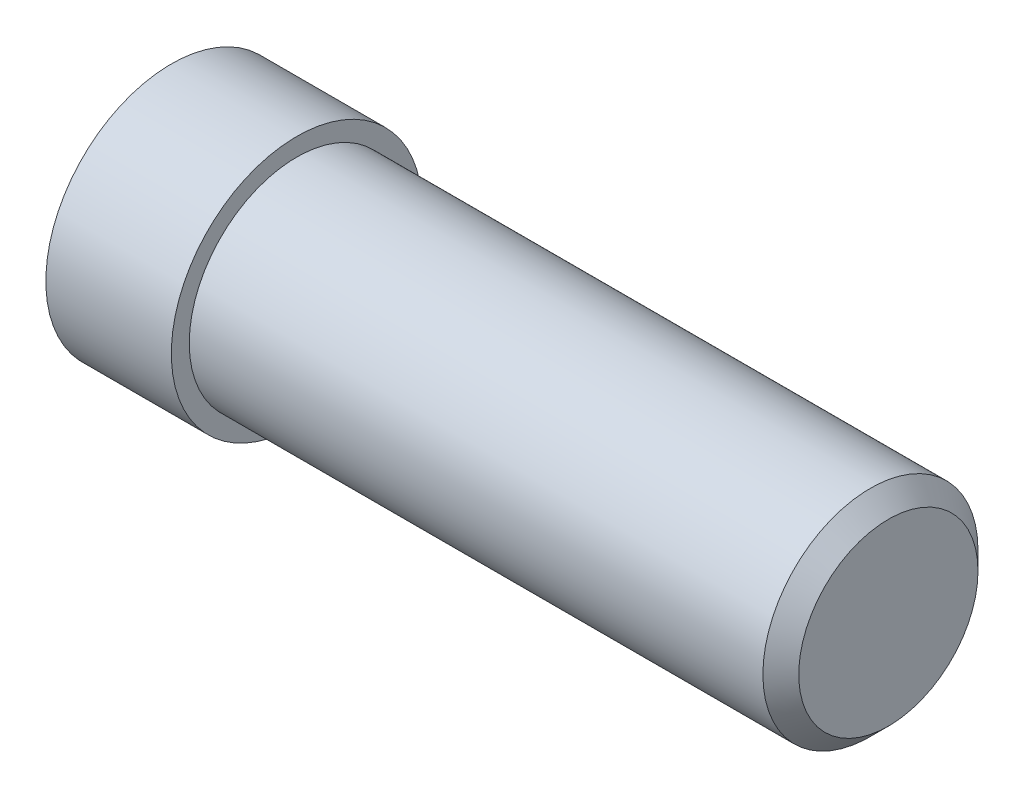
ISO-10303-21;
HEADER;
FILE_DESCRIPTION(('STEP AP214'),'2;1');
FILE_NAME('part.step','',(''),(''),'','','');
FILE_SCHEMA(('AUTOMOTIVE_DESIGN { 1 0 10303 214 1 1 1 1 }'));
ENDSEC;
DATA;
#1=APPLICATION_CONTEXT('core data for automotive mechanical design processes');
#2=APPLICATION_PROTOCOL_DEFINITION('international standard','automotive_design',2000,#1);
#3=PRODUCT_CONTEXT('',#1,'mechanical');
#4=PRODUCT('Part','Part','',(#3));
#5=PRODUCT_RELATED_PRODUCT_CATEGORY('part','',(#4));
#6=PRODUCT_DEFINITION_FORMATION('','',#4);
#7=PRODUCT_DEFINITION_CONTEXT('part definition',#1,'design');
#8=PRODUCT_DEFINITION('design','',#6,#7);
#9=PRODUCT_DEFINITION_SHAPE('','',#8);
#10=(LENGTH_UNIT() NAMED_UNIT(*) SI_UNIT(.MILLI.,.METRE.));
#11=(NAMED_UNIT(*) PLANE_ANGLE_UNIT() SI_UNIT($,.RADIAN.));
#12=(NAMED_UNIT(*) SI_UNIT($,.STERADIAN.) SOLID_ANGLE_UNIT());
#13=UNCERTAINTY_MEASURE_WITH_UNIT(LENGTH_MEASURE(1.E-05),#10,'distance_accuracy_value','');
#14=(GEOMETRIC_REPRESENTATION_CONTEXT(3) GLOBAL_UNCERTAINTY_ASSIGNED_CONTEXT((#13)) GLOBAL_UNIT_ASSIGNED_CONTEXT((#10,
#11,#12)) REPRESENTATION_CONTEXT('',''));
#15=CARTESIAN_POINT('',(0.,0.,0.));
#16=DIRECTION('',(0.,0.,1.));
#17=DIRECTION('',(1.,0.,0.));
#18=AXIS2_PLACEMENT_3D('',#15,#16,#17);
#19=CARTESIAN_POINT('',(0.,0.,-152.4));
#20=DIRECTION('',(1.,0.,0.));
#21=DIRECTION('',(0.,0.,-1.));
#22=AXIS2_PLACEMENT_3D('',#19,#20,#21);
#23=PLANE('',#22);
#24=CARTESIAN_POINT('',(0.,0.,0.));
#25=DIRECTION('',(1.,0.,0.));
#26=DIRECTION('',(0.,0.,-1.));
#27=AXIS2_PLACEMENT_3D('',#24,#25,#26);
#28=CIRCLE('',#27,127.);
#29=CARTESIAN_POINT('',(0.,0.,-127.));
#30=VERTEX_POINT('',#29);
#31=EDGE_CURVE('E48',#30,#30,#28,.T.);
#32=ORIENTED_EDGE('',*,*,#31,.T.);
#33=EDGE_LOOP('',(#32));
#34=FACE_BOUND('',#33,.T.);
#35=ADVANCED_FACE('F39',(#34),#23,.T.);
#36=CARTESIAN_POINT('',(-1016.,0.,0.));
#37=DIRECTION('',(-1.,0.,0.));
#38=DIRECTION('',(0.,0.,1.));
#39=AXIS2_PLACEMENT_3D('',#36,#37,#38);
#40=PLANE('',#39);
#41=CARTESIAN_POINT('',(-1016.,0.,0.));
#42=DIRECTION('',(1.,0.,0.));
#43=DIRECTION('',(0.,0.,-1.));
#44=AXIS2_PLACEMENT_3D('',#41,#42,#43);
#45=CIRCLE('',#44,177.8);
#46=CARTESIAN_POINT('',(-1016.,0.,-177.8));
#47=VERTEX_POINT('',#46);
#48=EDGE_CURVE('E53',#47,#47,#45,.T.);
#49=ORIENTED_EDGE('',*,*,#48,.F.);
#50=EDGE_LOOP('',(#49));
#51=FACE_BOUND('',#50,.T.);
#52=ADVANCED_FACE('F81',(#51),#40,.T.);
#53=CARTESIAN_POINT('',(0.,0.,0.));
#54=DIRECTION('',(1.,0.,0.));
#55=DIRECTION('',(0.,0.,-1.));
#56=AXIS2_PLACEMENT_3D('',#53,#54,#55);
#57=CYLINDRICAL_SURFACE('',#56,177.8);
#58=ORIENTED_EDGE('',*,*,#48,.T.);
#59=EDGE_LOOP('',(#58));
#60=FACE_BOUND('',#59,.T.);
#61=CARTESIAN_POINT('',(-838.2,0.,0.));
#62=DIRECTION('',(1.,0.,0.));
#63=DIRECTION('',(0.,0.,-1.));
#64=AXIS2_PLACEMENT_3D('',#61,#62,#63);
#65=CIRCLE('',#64,177.8);
#66=CARTESIAN_POINT('',(-838.2,0.,-177.8));
#67=VERTEX_POINT('',#66);
#68=EDGE_CURVE('E58',#67,#67,#65,.T.);
#69=ORIENTED_EDGE('',*,*,#68,.F.);
#70=EDGE_LOOP('',(#69));
#71=FACE_BOUND('',#70,.T.);
#72=ADVANCED_FACE('F73',(#60,#71),#57,.T.);
#73=CARTESIAN_POINT('',(-838.2,0.,-177.8));
#74=DIRECTION('',(1.,0.,0.));
#75=DIRECTION('',(0.,0.,-1.));
#76=AXIS2_PLACEMENT_3D('',#73,#74,#75);
#77=PLANE('',#76);
#78=ORIENTED_EDGE('',*,*,#68,.T.);
#79=EDGE_LOOP('',(#78));
#80=FACE_BOUND('',#79,.T.);
#81=CARTESIAN_POINT('',(-838.2,0.,0.));
#82=DIRECTION('',(1.,0.,0.));
#83=DIRECTION('',(0.,0.,-1.));
#84=AXIS2_PLACEMENT_3D('',#81,#82,#83);
#85=CIRCLE('',#84,152.4);
#86=CARTESIAN_POINT('',(-838.2,0.,-152.4));
#87=VERTEX_POINT('',#86);
#88=EDGE_CURVE('E64',#87,#87,#85,.T.);
#89=ORIENTED_EDGE('',*,*,#88,.F.);
#90=EDGE_LOOP('',(#89));
#91=FACE_BOUND('',#90,.T.);
#92=ADVANCED_FACE('F71',(#80,#91),#77,.T.);
#93=CARTESIAN_POINT('',(0.,0.,0.));
#94=DIRECTION('',(1.,0.,0.));
#95=DIRECTION('',(0.,0.,-1.));
#96=AXIS2_PLACEMENT_3D('',#93,#94,#95);
#97=CYLINDRICAL_SURFACE('',#96,152.4);
#98=CARTESIAN_POINT('',(-25.4000000000003,0.,0.));
#99=DIRECTION('',(1.,0.,0.));
#100=DIRECTION('',(0.,0.,-1.));
#101=AXIS2_PLACEMENT_3D('',#98,#99,#100);
#102=CIRCLE('',#101,152.4);
#103=CARTESIAN_POINT('',(-25.4000000000003,0.,-152.4));
#104=VERTEX_POINT('',#103);
#105=EDGE_CURVE('E10',#104,#104,#102,.F.);
#106=ORIENTED_EDGE('',*,*,#105,.T.);
#107=EDGE_LOOP('',(#106));
#108=FACE_BOUND('',#107,.T.);
#109=ORIENTED_EDGE('',*,*,#88,.T.);
#110=EDGE_LOOP('',(#109));
#111=FACE_BOUND('',#110,.T.);
#112=ADVANCED_FACE('F69',(#108,#111),#97,.T.);
#113=CARTESIAN_POINT('',(0.,0.,0.));
#114=DIRECTION('',(-1.,0.,0.));
#115=DIRECTION('',(0.,0.,1.));
#116=AXIS2_PLACEMENT_3D('',#113,#114,#115);
#117=CONICAL_SURFACE('',#116,127.,0.785398163397447);
#118=ORIENTED_EDGE('',*,*,#105,.F.);
#119=EDGE_LOOP('',(#118));
#120=FACE_BOUND('',#119,.T.);
#121=ORIENTED_EDGE('',*,*,#31,.F.);
#122=EDGE_LOOP('',(#121));
#123=FACE_BOUND('',#122,.T.);
#124=ADVANCED_FACE('F42',(#120,#123),#117,.T.);
#125=CLOSED_SHELL('',(#35,#52,#72,#92,#112,#124));
#126=MANIFOLD_SOLID_BREP('B2',#125);
#127=ADVANCED_BREP_SHAPE_REPRESENTATION('',(#18,#126),#14);
#128=SHAPE_DEFINITION_REPRESENTATION(#9,#127);
ENDSEC;
END-ISO-10303-21;
